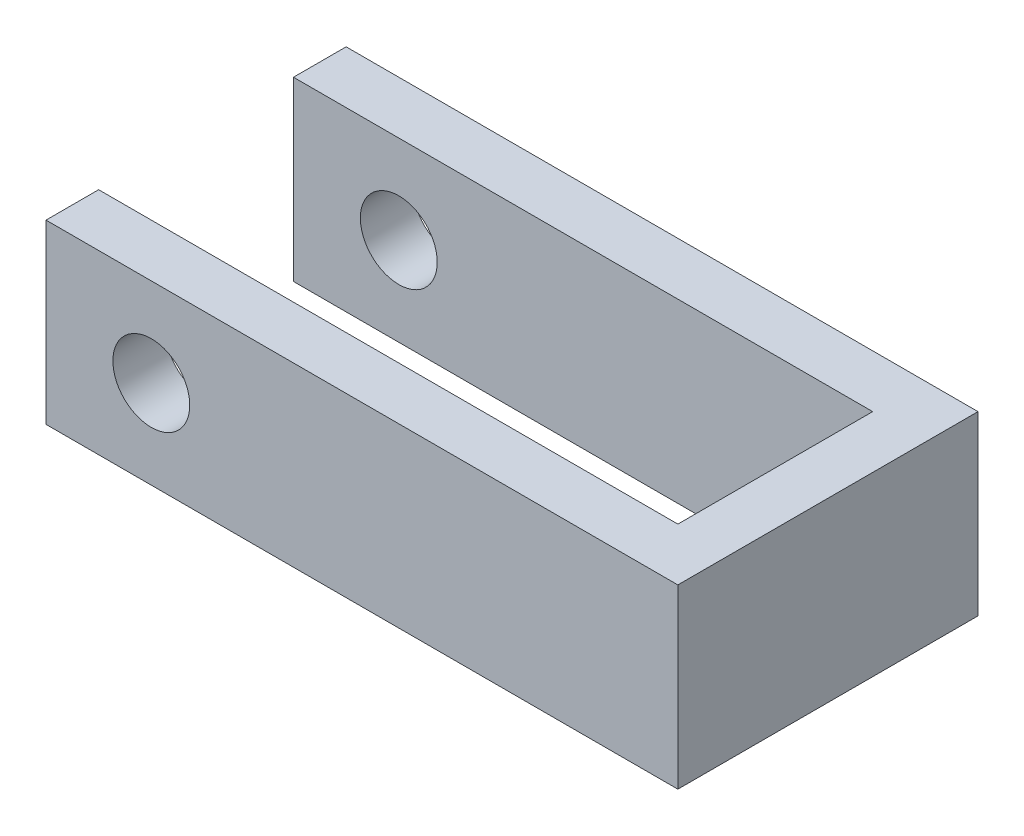
ISO-10303-21;
HEADER;
FILE_DESCRIPTION(('STEP AP214'),'2;1');
FILE_NAME('part.step','',(''),(''),'','','');
FILE_SCHEMA(('AUTOMOTIVE_DESIGN { 1 0 10303 214 1 1 1 1 }'));
ENDSEC;
DATA;
#1=APPLICATION_CONTEXT('core data for automotive mechanical design processes');
#2=APPLICATION_PROTOCOL_DEFINITION('international standard','automotive_design',2000,#1);
#3=PRODUCT_CONTEXT('',#1,'mechanical');
#4=PRODUCT('Part','Part','',(#3));
#5=PRODUCT_RELATED_PRODUCT_CATEGORY('part','',(#4));
#6=PRODUCT_DEFINITION_FORMATION('','',#4);
#7=PRODUCT_DEFINITION_CONTEXT('part definition',#1,'design');
#8=PRODUCT_DEFINITION('design','',#6,#7);
#9=PRODUCT_DEFINITION_SHAPE('','',#8);
#10=(LENGTH_UNIT() NAMED_UNIT(*) SI_UNIT(.MILLI.,.METRE.));
#11=(NAMED_UNIT(*) PLANE_ANGLE_UNIT() SI_UNIT($,.RADIAN.));
#12=(NAMED_UNIT(*) SI_UNIT($,.STERADIAN.) SOLID_ANGLE_UNIT());
#13=UNCERTAINTY_MEASURE_WITH_UNIT(LENGTH_MEASURE(1.E-05),#10,'distance_accuracy_value','');
#14=(GEOMETRIC_REPRESENTATION_CONTEXT(3) GLOBAL_UNCERTAINTY_ASSIGNED_CONTEXT((#13)) GLOBAL_UNIT_ASSIGNED_CONTEXT((#10,
#11,#12)) REPRESENTATION_CONTEXT('',''));
#15=CARTESIAN_POINT('',(0.,0.,0.));
#16=DIRECTION('',(0.,0.,1.));
#17=DIRECTION('',(1.,0.,0.));
#18=AXIS2_PLACEMENT_3D('',#15,#16,#17);
#19=CARTESIAN_POINT('',(0.,-16.8,9.25));
#20=DIRECTION('',(0.,0.,-1.));
#21=DIRECTION('',(-1.,0.,0.));
#22=AXIS2_PLACEMENT_3D('',#19,#20,#21);
#23=PLANE('',#22);
#24=CARTESIAN_POINT('',(-47.5,-8.40000000000001,9.24999999999998));
#25=DIRECTION('',(0.,0.,-1.));
#26=DIRECTION('',(-1.,0.,0.));
#27=AXIS2_PLACEMENT_3D('',#24,#25,#26);
#28=CIRCLE('',#27,3.65);
#29=CARTESIAN_POINT('',(-51.15,-8.40000000000001,9.24999999999998));
#30=VERTEX_POINT('',#29);
#31=EDGE_CURVE('E137',#30,#30,#28,.T.);
#32=ORIENTED_EDGE('',*,*,#31,.F.);
#33=EDGE_LOOP('',(#32));
#34=FACE_BOUND('',#33,.T.);
#35=DIRECTION('',(-1.,0.,0.));
#36=VECTOR('',#35,1.);
#37=CARTESIAN_POINT('',(0.,0.,9.25));
#38=LINE('',#37,#36);
#39=CARTESIAN_POINT('',(-2.5,0.,9.25));
#40=VERTEX_POINT('',#39);
#41=CARTESIAN_POINT('',(-57.5,0.,9.25000000000001));
#42=VERTEX_POINT('',#41);
#43=EDGE_CURVE('E133',#40,#42,#38,.T.);
#44=ORIENTED_EDGE('',*,*,#43,.F.);
#45=DIRECTION('',(0.,1.,0.));
#46=VECTOR('',#45,1.);
#47=CARTESIAN_POINT('',(-2.5,-16.8,9.25));
#48=LINE('',#47,#46);
#49=CARTESIAN_POINT('',(-2.5,-16.8,9.25));
#50=VERTEX_POINT('',#49);
#51=EDGE_CURVE('E11',#50,#40,#48,.T.);
#52=ORIENTED_EDGE('',*,*,#51,.F.);
#53=DIRECTION('',(-1.,0.,0.));
#54=VECTOR('',#53,1.);
#55=CARTESIAN_POINT('',(0.,-16.8,9.25));
#56=LINE('',#55,#54);
#57=CARTESIAN_POINT('',(-57.5,-16.8,9.25000000000001));
#58=VERTEX_POINT('',#57);
#59=EDGE_CURVE('E151',#50,#58,#56,.T.);
#60=ORIENTED_EDGE('',*,*,#59,.T.);
#61=DIRECTION('',(0.,1.,0.));
#62=VECTOR('',#61,1.);
#63=CARTESIAN_POINT('',(-57.5,-16.8,9.25000000000001));
#64=LINE('',#63,#62);
#65=EDGE_CURVE('E37',#58,#42,#64,.T.);
#66=ORIENTED_EDGE('',*,*,#65,.T.);
#67=EDGE_LOOP('',(#44,#52,#60,#66));
#68=FACE_BOUND('',#67,.T.);
#69=ADVANCED_FACE('F34',(#34,#68),#23,.T.);
#70=CARTESIAN_POINT('',(-2.5,-16.8,0.));
#71=DIRECTION('',(1.,0.,0.));
#72=DIRECTION('',(0.,0.,-1.));
#73=AXIS2_PLACEMENT_3D('',#70,#71,#72);
#74=PLANE('',#73);
#75=DIRECTION('',(0.,0.,-1.));
#76=VECTOR('',#75,1.);
#77=CARTESIAN_POINT('',(-2.5,0.,0.));
#78=LINE('',#77,#76);
#79=CARTESIAN_POINT('',(-2.5,0.,-9.25));
#80=VERTEX_POINT('',#79);
#81=EDGE_CURVE('E79',#40,#80,#78,.T.);
#82=ORIENTED_EDGE('',*,*,#81,.T.);
#83=DIRECTION('',(0.,1.,0.));
#84=VECTOR('',#83,1.);
#85=CARTESIAN_POINT('',(-2.5,-16.8,-9.25));
#86=LINE('',#85,#84);
#87=CARTESIAN_POINT('',(-2.5,-16.8,-9.25));
#88=VERTEX_POINT('',#87);
#89=EDGE_CURVE('E43',#88,#80,#86,.T.);
#90=ORIENTED_EDGE('',*,*,#89,.F.);
#91=DIRECTION('',(0.,0.,-1.));
#92=VECTOR('',#91,1.);
#93=CARTESIAN_POINT('',(-2.5,-16.8,0.));
#94=LINE('',#93,#92);
#95=EDGE_CURVE('E111',#50,#88,#94,.T.);
#96=ORIENTED_EDGE('',*,*,#95,.F.);
#97=ORIENTED_EDGE('',*,*,#51,.T.);
#98=EDGE_LOOP('',(#82,#90,#96,#97));
#99=FACE_BOUND('',#98,.T.);
#100=ADVANCED_FACE('F203',(#99),#74,.F.);
#101=CARTESIAN_POINT('',(0.,-16.8,-9.25));
#102=DIRECTION('',(0.,0.,-1.));
#103=DIRECTION('',(-1.,0.,0.));
#104=AXIS2_PLACEMENT_3D('',#101,#102,#103);
#105=PLANE('',#104);
#106=CARTESIAN_POINT('',(-47.5,-8.40000000000001,-9.24999999999999));
#107=DIRECTION('',(0.,0.,-1.));
#108=DIRECTION('',(-1.,0.,0.));
#109=AXIS2_PLACEMENT_3D('',#106,#107,#108);
#110=CIRCLE('',#109,3.65);
#111=CARTESIAN_POINT('',(-51.15,-8.40000000000001,-9.24999999999999));
#112=VERTEX_POINT('',#111);
#113=EDGE_CURVE('E184',#112,#112,#110,.T.);
#114=ORIENTED_EDGE('',*,*,#113,.T.);
#115=EDGE_LOOP('',(#114));
#116=FACE_BOUND('',#115,.T.);
#117=DIRECTION('',(-1.,0.,0.));
#118=VECTOR('',#117,1.);
#119=CARTESIAN_POINT('',(0.,0.,-9.25));
#120=LINE('',#119,#118);
#121=CARTESIAN_POINT('',(-57.5,0.,-9.24999999999999));
#122=VERTEX_POINT('',#121);
#123=EDGE_CURVE('E118',#80,#122,#120,.T.);
#124=ORIENTED_EDGE('',*,*,#123,.T.);
#125=DIRECTION('',(0.,1.,0.));
#126=VECTOR('',#125,1.);
#127=CARTESIAN_POINT('',(-57.5,-16.8,-9.24999999999999));
#128=LINE('',#127,#126);
#129=CARTESIAN_POINT('',(-57.5,-16.8,-9.24999999999999));
#130=VERTEX_POINT('',#129);
#131=EDGE_CURVE('E115',#130,#122,#128,.T.);
#132=ORIENTED_EDGE('',*,*,#131,.F.);
#133=DIRECTION('',(-1.,0.,0.));
#134=VECTOR('',#133,1.);
#135=CARTESIAN_POINT('',(0.,-16.8,-9.25));
#136=LINE('',#135,#134);
#137=EDGE_CURVE('E103',#88,#130,#136,.T.);
#138=ORIENTED_EDGE('',*,*,#137,.F.);
#139=ORIENTED_EDGE('',*,*,#89,.T.);
#140=EDGE_LOOP('',(#124,#132,#138,#139));
#141=FACE_BOUND('',#140,.T.);
#142=ADVANCED_FACE('F116',(#116,#141),#105,.F.);
#143=CARTESIAN_POINT('',(-57.5,-16.8,0.));
#144=DIRECTION('',(1.,0.,0.));
#145=DIRECTION('',(0.,0.,-1.));
#146=AXIS2_PLACEMENT_3D('',#143,#144,#145);
#147=PLANE('',#146);
#148=DIRECTION('',(0.,0.,-1.));
#149=VECTOR('',#148,1.);
#150=CARTESIAN_POINT('',(-57.5,0.,0.));
#151=LINE('',#150,#149);
#152=CARTESIAN_POINT('',(-57.5,0.,-14.25));
#153=VERTEX_POINT('',#152);
#154=EDGE_CURVE('E148',#122,#153,#151,.T.);
#155=ORIENTED_EDGE('',*,*,#154,.T.);
#156=DIRECTION('',(0.,1.,0.));
#157=VECTOR('',#156,1.);
#158=CARTESIAN_POINT('',(-57.5,-16.8,-14.25));
#159=LINE('',#158,#157);
#160=CARTESIAN_POINT('',(-57.5,-16.8,-14.25));
#161=VERTEX_POINT('',#160);
#162=EDGE_CURVE('E122',#161,#153,#159,.T.);
#163=ORIENTED_EDGE('',*,*,#162,.F.);
#164=DIRECTION('',(0.,0.,-1.));
#165=VECTOR('',#164,1.);
#166=CARTESIAN_POINT('',(-57.5,-16.8,0.));
#167=LINE('',#166,#165);
#168=EDGE_CURVE('E109',#130,#161,#167,.T.);
#169=ORIENTED_EDGE('',*,*,#168,.F.);
#170=ORIENTED_EDGE('',*,*,#131,.T.);
#171=EDGE_LOOP('',(#155,#163,#169,#170));
#172=FACE_BOUND('',#171,.T.);
#173=ADVANCED_FACE('F124',(#172),#147,.F.);
#174=CARTESIAN_POINT('',(0.,-16.8,-14.25));
#175=DIRECTION('',(0.,0.,-1.));
#176=DIRECTION('',(-1.,0.,0.));
#177=AXIS2_PLACEMENT_3D('',#174,#175,#176);
#178=PLANE('',#177);
#179=CARTESIAN_POINT('',(-47.5,-8.40000000000001,-14.25));
#180=DIRECTION('',(0.,0.,1.));
#181=DIRECTION('',(1.,0.,0.));
#182=AXIS2_PLACEMENT_3D('',#179,#180,#181);
#183=CIRCLE('',#182,3.65);
#184=CARTESIAN_POINT('',(-43.85,-8.40000000000001,-14.25));
#185=VERTEX_POINT('',#184);
#186=EDGE_CURVE('E187',#185,#185,#183,.T.);
#187=ORIENTED_EDGE('',*,*,#186,.T.);
#188=EDGE_LOOP('',(#187));
#189=FACE_BOUND('',#188,.T.);
#190=DIRECTION('',(-1.,0.,0.));
#191=VECTOR('',#190,1.);
#192=CARTESIAN_POINT('',(0.,0.,-14.25));
#193=LINE('',#192,#191);
#194=CARTESIAN_POINT('',(2.5,0.,-14.25));
#195=VERTEX_POINT('',#194);
#196=EDGE_CURVE('E145',#195,#153,#193,.T.);
#197=ORIENTED_EDGE('',*,*,#196,.F.);
#198=DIRECTION('',(0.,1.,0.));
#199=VECTOR('',#198,1.);
#200=CARTESIAN_POINT('',(2.5,-16.8,-14.25));
#201=LINE('',#200,#199);
#202=CARTESIAN_POINT('',(2.5,-16.8,-14.25));
#203=VERTEX_POINT('',#202);
#204=EDGE_CURVE('E155',#203,#195,#201,.T.);
#205=ORIENTED_EDGE('',*,*,#204,.F.);
#206=DIRECTION('',(-1.,0.,0.));
#207=VECTOR('',#206,1.);
#208=CARTESIAN_POINT('',(0.,-16.8,-14.25));
#209=LINE('',#208,#207);
#210=EDGE_CURVE('E126',#203,#161,#209,.T.);
#211=ORIENTED_EDGE('',*,*,#210,.T.);
#212=ORIENTED_EDGE('',*,*,#162,.T.);
#213=EDGE_LOOP('',(#197,#205,#211,#212));
#214=FACE_BOUND('',#213,.T.);
#215=ADVANCED_FACE('F168',(#189,#214),#178,.T.);
#216=CARTESIAN_POINT('',(2.49999999999999,-16.8,0.));
#217=DIRECTION('',(-1.,0.,0.));
#218=DIRECTION('',(0.,0.,1.));
#219=AXIS2_PLACEMENT_3D('',#216,#217,#218);
#220=PLANE('',#219);
#221=DIRECTION('',(0.,0.,1.));
#222=VECTOR('',#221,1.);
#223=CARTESIAN_POINT('',(2.49999999999999,0.,0.));
#224=LINE('',#223,#222);
#225=CARTESIAN_POINT('',(2.5,0.,14.25));
#226=VERTEX_POINT('',#225);
#227=EDGE_CURVE('E143',#195,#226,#224,.T.);
#228=ORIENTED_EDGE('',*,*,#227,.T.);
#229=DIRECTION('',(0.,1.,0.));
#230=VECTOR('',#229,1.);
#231=CARTESIAN_POINT('',(2.5,-16.8,14.25));
#232=LINE('',#231,#230);
#233=CARTESIAN_POINT('',(2.5,-16.8,14.25));
#234=VERTEX_POINT('',#233);
#235=EDGE_CURVE('E157',#234,#226,#232,.T.);
#236=ORIENTED_EDGE('',*,*,#235,.F.);
#237=DIRECTION('',(0.,0.,1.));
#238=VECTOR('',#237,1.);
#239=CARTESIAN_POINT('',(2.49999999999999,-16.8,0.));
#240=LINE('',#239,#238);
#241=EDGE_CURVE('E128',#203,#234,#240,.T.);
#242=ORIENTED_EDGE('',*,*,#241,.F.);
#243=ORIENTED_EDGE('',*,*,#204,.T.);
#244=EDGE_LOOP('',(#228,#236,#242,#243));
#245=FACE_BOUND('',#244,.T.);
#246=ADVANCED_FACE('F174',(#245),#220,.F.);
#247=CARTESIAN_POINT('',(0.,-16.8,14.25));
#248=DIRECTION('',(0.,0.,-1.));
#249=DIRECTION('',(-1.,0.,0.));
#250=AXIS2_PLACEMENT_3D('',#247,#248,#249);
#251=PLANE('',#250);
#252=CARTESIAN_POINT('',(-47.5,-8.40000000000001,14.25));
#253=DIRECTION('',(0.,0.,1.));
#254=DIRECTION('',(1.,0.,0.));
#255=AXIS2_PLACEMENT_3D('',#252,#253,#254);
#256=CIRCLE('',#255,3.65);
#257=CARTESIAN_POINT('',(-43.85,-8.40000000000001,14.25));
#258=VERTEX_POINT('',#257);
#259=EDGE_CURVE('E188',#258,#258,#256,.T.);
#260=ORIENTED_EDGE('',*,*,#259,.F.);
#261=EDGE_LOOP('',(#260));
#262=FACE_BOUND('',#261,.T.);
#263=DIRECTION('',(-1.,0.,0.));
#264=VECTOR('',#263,1.);
#265=CARTESIAN_POINT('',(0.,0.,14.25));
#266=LINE('',#265,#264);
#267=CARTESIAN_POINT('',(-57.5,0.,14.25));
#268=VERTEX_POINT('',#267);
#269=EDGE_CURVE('E140',#226,#268,#266,.T.);
#270=ORIENTED_EDGE('',*,*,#269,.T.);
#271=DIRECTION('',(0.,1.,0.));
#272=VECTOR('',#271,1.);
#273=CARTESIAN_POINT('',(-57.5,-16.8,14.25));
#274=LINE('',#273,#272);
#275=CARTESIAN_POINT('',(-57.5,-16.8,14.25));
#276=VERTEX_POINT('',#275);
#277=EDGE_CURVE('E159',#276,#268,#274,.T.);
#278=ORIENTED_EDGE('',*,*,#277,.F.);
#279=DIRECTION('',(-1.,0.,0.));
#280=VECTOR('',#279,1.);
#281=CARTESIAN_POINT('',(0.,-16.8,14.25));
#282=LINE('',#281,#280);
#283=EDGE_CURVE('E172',#234,#276,#282,.T.);
#284=ORIENTED_EDGE('',*,*,#283,.F.);
#285=ORIENTED_EDGE('',*,*,#235,.T.);
#286=EDGE_LOOP('',(#270,#278,#284,#285));
#287=FACE_BOUND('',#286,.T.);
#288=ADVANCED_FACE('F176',(#262,#287),#251,.F.);
#289=CARTESIAN_POINT('',(-57.5,-16.8,0.));
#290=DIRECTION('',(-1.,0.,0.));
#291=DIRECTION('',(0.,0.,1.));
#292=AXIS2_PLACEMENT_3D('',#289,#290,#291);
#293=PLANE('',#292);
#294=DIRECTION('',(0.,0.,1.));
#295=VECTOR('',#294,1.);
#296=CARTESIAN_POINT('',(-57.5,0.,0.));
#297=LINE('',#296,#295);
#298=EDGE_CURVE('E136',#42,#268,#297,.T.);
#299=ORIENTED_EDGE('',*,*,#298,.F.);
#300=ORIENTED_EDGE('',*,*,#65,.F.);
#301=DIRECTION('',(0.,0.,1.));
#302=VECTOR('',#301,1.);
#303=CARTESIAN_POINT('',(-57.5,-16.8,0.));
#304=LINE('',#303,#302);
#305=EDGE_CURVE('E177',#58,#276,#304,.T.);
#306=ORIENTED_EDGE('',*,*,#305,.T.);
#307=ORIENTED_EDGE('',*,*,#277,.T.);
#308=EDGE_LOOP('',(#299,#300,#306,#307));
#309=FACE_BOUND('',#308,.T.);
#310=ADVANCED_FACE('F161',(#309),#293,.T.);
#311=CARTESIAN_POINT('',(0.,-16.8,0.));
#312=DIRECTION('',(0.,1.,0.));
#313=DIRECTION('',(0.,0.,1.));
#314=AXIS2_PLACEMENT_3D('',#311,#312,#313);
#315=PLANE('',#314);
#316=ORIENTED_EDGE('',*,*,#59,.F.);
#317=ORIENTED_EDGE('',*,*,#95,.T.);
#318=ORIENTED_EDGE('',*,*,#137,.T.);
#319=ORIENTED_EDGE('',*,*,#168,.T.);
#320=ORIENTED_EDGE('',*,*,#210,.F.);
#321=ORIENTED_EDGE('',*,*,#241,.T.);
#322=ORIENTED_EDGE('',*,*,#283,.T.);
#323=ORIENTED_EDGE('',*,*,#305,.F.);
#324=EDGE_LOOP('',(#316,#317,#318,#319,#320,#321,#322,#323));
#325=FACE_BOUND('',#324,.T.);
#326=ADVANCED_FACE('F106',(#325),#315,.F.);
#327=CARTESIAN_POINT('',(0.,0.,0.));
#328=DIRECTION('',(0.,1.,0.));
#329=DIRECTION('',(0.,0.,1.));
#330=AXIS2_PLACEMENT_3D('',#327,#328,#329);
#331=PLANE('',#330);
#332=ORIENTED_EDGE('',*,*,#43,.T.);
#333=ORIENTED_EDGE('',*,*,#298,.T.);
#334=ORIENTED_EDGE('',*,*,#269,.F.);
#335=ORIENTED_EDGE('',*,*,#227,.F.);
#336=ORIENTED_EDGE('',*,*,#196,.T.);
#337=ORIENTED_EDGE('',*,*,#154,.F.);
#338=ORIENTED_EDGE('',*,*,#123,.F.);
#339=ORIENTED_EDGE('',*,*,#81,.F.);
#340=EDGE_LOOP('',(#332,#333,#334,#335,#336,#337,#338,#339));
#341=FACE_BOUND('',#340,.T.);
#342=ADVANCED_FACE('F164',(#341),#331,.T.);
#343=CARTESIAN_POINT('',(-47.5,-8.40000000000001,-14.25));
#344=DIRECTION('',(0.,0.,1.));
#345=DIRECTION('',(1.,0.,0.));
#346=AXIS2_PLACEMENT_3D('',#343,#344,#345);
#347=CYLINDRICAL_SURFACE('',#346,3.65);
#348=ORIENTED_EDGE('',*,*,#31,.T.);
#349=EDGE_LOOP('',(#348));
#350=FACE_BOUND('',#349,.T.);
#351=ORIENTED_EDGE('',*,*,#259,.T.);
#352=EDGE_LOOP('',(#351));
#353=FACE_BOUND('',#352,.T.);
#354=ADVANCED_FACE('F198',(#350,#353),#347,.F.);
#355=ORIENTED_EDGE('',*,*,#186,.F.);
#356=EDGE_LOOP('',(#355));
#357=FACE_BOUND('',#356,.T.);
#358=ORIENTED_EDGE('',*,*,#113,.F.);
#359=EDGE_LOOP('',(#358));
#360=FACE_BOUND('',#359,.T.);
#361=ADVANCED_FACE('F195',(#357,#360),#347,.F.);
#362=CLOSED_SHELL('',(#69,#100,#142,#173,#215,#246,#288,#310,#326,#342,#354,#361));
#363=MANIFOLD_SOLID_BREP('B2',#362);
#364=ADVANCED_BREP_SHAPE_REPRESENTATION('',(#18,#363),#14);
#365=SHAPE_DEFINITION_REPRESENTATION(#9,#364);
ENDSEC;
END-ISO-10303-21;
